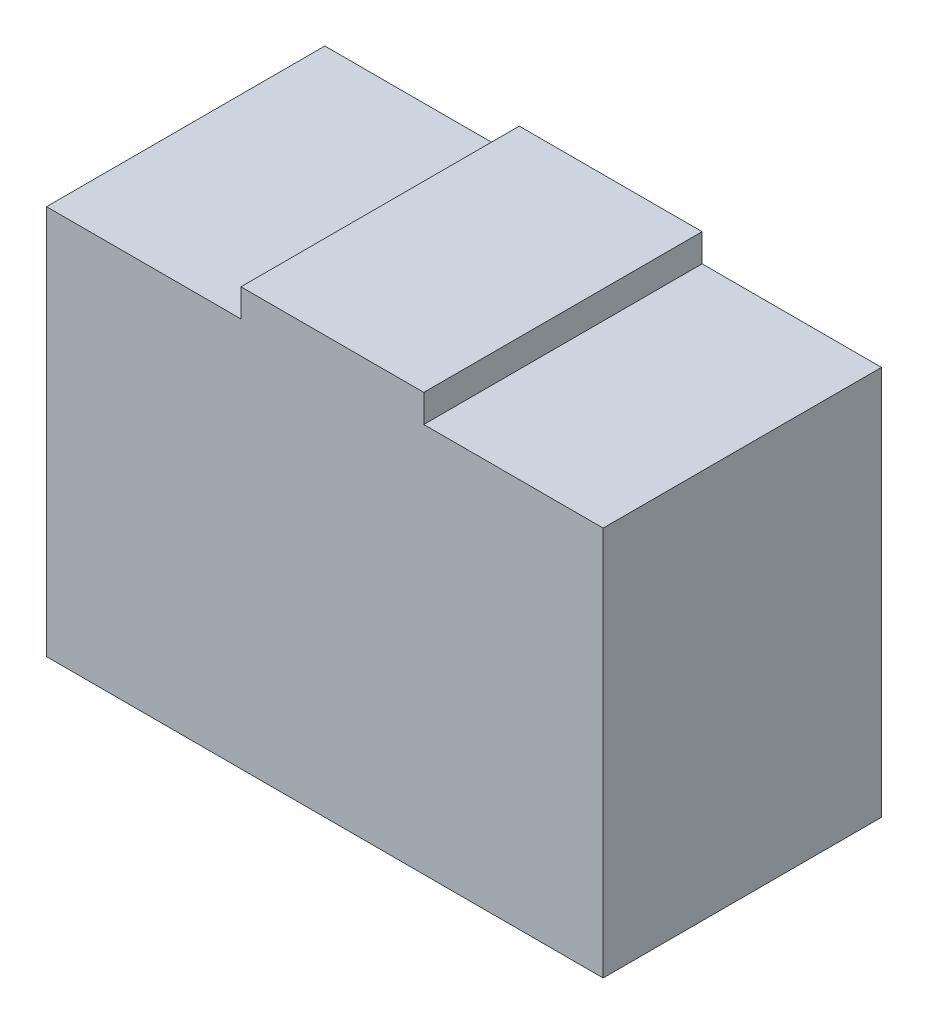
ISO-10303-21;
HEADER;
FILE_DESCRIPTION(('STEP AP214'),'2;1');
FILE_NAME('part.step','',(''),(''),'','','');
FILE_SCHEMA(('AUTOMOTIVE_DESIGN { 1 0 10303 214 1 1 1 1 }'));
ENDSEC;
DATA;
#1=APPLICATION_CONTEXT('core data for automotive mechanical design processes');
#2=APPLICATION_PROTOCOL_DEFINITION('international standard','automotive_design',2000,#1);
#3=PRODUCT_CONTEXT('',#1,'mechanical');
#4=PRODUCT('Part','Part','',(#3));
#5=PRODUCT_RELATED_PRODUCT_CATEGORY('part','',(#4));
#6=PRODUCT_DEFINITION_FORMATION('','',#4);
#7=PRODUCT_DEFINITION_CONTEXT('part definition',#1,'design');
#8=PRODUCT_DEFINITION('design','',#6,#7);
#9=PRODUCT_DEFINITION_SHAPE('','',#8);
#10=(LENGTH_UNIT() NAMED_UNIT(*) SI_UNIT(.MILLI.,.METRE.));
#11=(NAMED_UNIT(*) PLANE_ANGLE_UNIT() SI_UNIT($,.RADIAN.));
#12=(NAMED_UNIT(*) SI_UNIT($,.STERADIAN.) SOLID_ANGLE_UNIT());
#13=UNCERTAINTY_MEASURE_WITH_UNIT(LENGTH_MEASURE(1.E-05),#10,'distance_accuracy_value','');
#14=(GEOMETRIC_REPRESENTATION_CONTEXT(3) GLOBAL_UNCERTAINTY_ASSIGNED_CONTEXT((#13)) GLOBAL_UNIT_ASSIGNED_CONTEXT((#10,
#11,#12)) REPRESENTATION_CONTEXT('',''));
#15=CARTESIAN_POINT('',(0.,0.,0.));
#16=DIRECTION('',(0.,0.,1.));
#17=DIRECTION('',(1.,0.,0.));
#18=AXIS2_PLACEMENT_3D('',#15,#16,#17);
#19=CARTESIAN_POINT('',(-0.964285714285714,1.00446428571429,0.5));
#20=DIRECTION('',(0.,-1.,0.));
#21=DIRECTION('',(0.,0.,-1.));
#22=AXIS2_PLACEMENT_3D('',#19,#20,#21);
#23=PLANE('',#22);
#24=DIRECTION('',(0.,0.,1.));
#25=VECTOR('',#24,1.);
#26=CARTESIAN_POINT('',(-0.615018224617643,1.00446428571429,0.));
#27=LINE('',#26,#25);
#28=CARTESIAN_POINT('',(-0.615018224617643,1.00446428571429,0.));
#29=VERTEX_POINT('',#28);
#30=CARTESIAN_POINT('',(-0.615018224617643,1.00446428571429,0.5));
#31=VERTEX_POINT('',#30);
#32=EDGE_CURVE('E124',#29,#31,#27,.T.);
#33=ORIENTED_EDGE('',*,*,#32,.F.);
#34=DIRECTION('',(-1.,0.,0.));
#35=VECTOR('',#34,1.);
#36=CARTESIAN_POINT('',(-0.964285714285714,1.00446428571429,0.));
#37=LINE('',#36,#35);
#38=CARTESIAN_POINT('',(-0.964285714285714,1.00446428571429,0.));
#39=VERTEX_POINT('',#38);
#40=EDGE_CURVE('E147',#29,#39,#37,.T.);
#41=ORIENTED_EDGE('',*,*,#40,.T.);
#42=DIRECTION('',(0.,0.,-1.));
#43=VECTOR('',#42,1.);
#44=CARTESIAN_POINT('',(-0.964285714285714,1.00446428571429,0.5));
#45=LINE('',#44,#43);
#46=CARTESIAN_POINT('',(-0.964285714285714,1.00446428571429,0.5));
#47=VERTEX_POINT('',#46);
#48=EDGE_CURVE('E142',#47,#39,#45,.T.);
#49=ORIENTED_EDGE('',*,*,#48,.F.);
#50=DIRECTION('',(-1.,0.,0.));
#51=VECTOR('',#50,1.);
#52=CARTESIAN_POINT('',(-0.964285714285714,1.00446428571429,0.5));
#53=LINE('',#52,#51);
#54=EDGE_CURVE('E51',#31,#47,#53,.T.);
#55=ORIENTED_EDGE('',*,*,#54,.F.);
#56=EDGE_LOOP('',(#33,#41,#49,#55));
#57=FACE_BOUND('',#56,.T.);
#58=ADVANCED_FACE('F36',(#57),#23,.F.);
#59=DIRECTION('',(0.,0.,-1.));
#60=VECTOR('',#59,1.);
#61=CARTESIAN_POINT('',(-0.28653362991804,1.00446428571429,0.));
#62=LINE('',#61,#60);
#63=CARTESIAN_POINT('',(-0.28653362991804,1.00446428571429,0.5));
#64=VERTEX_POINT('',#63);
#65=CARTESIAN_POINT('',(-0.28653362991804,1.00446428571429,0.));
#66=VERTEX_POINT('',#65);
#67=EDGE_CURVE('E59',#64,#66,#62,.T.);
#68=ORIENTED_EDGE('',*,*,#67,.F.);
#69=CARTESIAN_POINT('',(0.0357142857142861,1.00446428571429,0.5));
#70=VERTEX_POINT('',#69);
#71=EDGE_CURVE('E141',#70,#64,#53,.T.);
#72=ORIENTED_EDGE('',*,*,#71,.F.);
#73=DIRECTION('',(0.,0.,-1.));
#74=VECTOR('',#73,1.);
#75=CARTESIAN_POINT('',(0.0357142857142861,1.00446428571429,0.5));
#76=LINE('',#75,#74);
#77=CARTESIAN_POINT('',(0.0357142857142861,1.00446428571429,0.));
#78=VERTEX_POINT('',#77);
#79=EDGE_CURVE('E151',#70,#78,#76,.T.);
#80=ORIENTED_EDGE('',*,*,#79,.T.);
#81=EDGE_CURVE('E137',#78,#66,#37,.T.);
#82=ORIENTED_EDGE('',*,*,#81,.T.);
#83=EDGE_LOOP('',(#68,#72,#80,#82));
#84=FACE_BOUND('',#83,.T.);
#85=ADVANCED_FACE('F167',(#84),#23,.F.);
#86=CARTESIAN_POINT('',(-0.964285714285714,1.00446428571429,0.5));
#87=DIRECTION('',(1.,0.,0.));
#88=DIRECTION('',(0.,1.,0.));
#89=AXIS2_PLACEMENT_3D('',#86,#87,#88);
#90=PLANE('',#89);
#91=DIRECTION('',(0.,-1.,0.));
#92=VECTOR('',#91,1.);
#93=CARTESIAN_POINT('',(-0.964285714285714,1.00446428571429,0.));
#94=LINE('',#93,#92);
#95=CARTESIAN_POINT('',(-0.964285714285714,0.304464285714285,0.));
#96=VERTEX_POINT('',#95);
#97=EDGE_CURVE('E125',#39,#96,#94,.T.);
#98=ORIENTED_EDGE('',*,*,#97,.T.);
#99=DIRECTION('',(0.,0.,-1.));
#100=VECTOR('',#99,1.);
#101=CARTESIAN_POINT('',(-0.964285714285714,0.304464285714285,0.5));
#102=LINE('',#101,#100);
#103=CARTESIAN_POINT('',(-0.964285714285714,0.304464285714285,0.5));
#104=VERTEX_POINT('',#103);
#105=EDGE_CURVE('E11',#104,#96,#102,.T.);
#106=ORIENTED_EDGE('',*,*,#105,.F.);
#107=DIRECTION('',(0.,-1.,0.));
#108=VECTOR('',#107,1.);
#109=CARTESIAN_POINT('',(-0.964285714285714,1.00446428571429,0.5));
#110=LINE('',#109,#108);
#111=EDGE_CURVE('E134',#47,#104,#110,.T.);
#112=ORIENTED_EDGE('',*,*,#111,.F.);
#113=ORIENTED_EDGE('',*,*,#48,.T.);
#114=EDGE_LOOP('',(#98,#106,#112,#113));
#115=FACE_BOUND('',#114,.T.);
#116=ADVANCED_FACE('F38',(#115),#90,.F.);
#117=CARTESIAN_POINT('',(-0.964285714285714,0.304464285714285,0.5));
#118=DIRECTION('',(0.,1.,0.));
#119=DIRECTION('',(0.,0.,1.));
#120=AXIS2_PLACEMENT_3D('',#117,#118,#119);
#121=PLANE('',#120);
#122=DIRECTION('',(1.,0.,0.));
#123=VECTOR('',#122,1.);
#124=CARTESIAN_POINT('',(-0.964285714285714,0.304464285714285,0.));
#125=LINE('',#124,#123);
#126=CARTESIAN_POINT('',(0.0357142857142859,0.304464285714285,0.));
#127=VERTEX_POINT('',#126);
#128=EDGE_CURVE('E128',#96,#127,#125,.T.);
#129=ORIENTED_EDGE('',*,*,#128,.T.);
#130=DIRECTION('',(0.,0.,-1.));
#131=VECTOR('',#130,1.);
#132=CARTESIAN_POINT('',(0.0357142857142859,0.304464285714285,0.5));
#133=LINE('',#132,#131);
#134=CARTESIAN_POINT('',(0.0357142857142859,0.304464285714285,0.5));
#135=VERTEX_POINT('',#134);
#136=EDGE_CURVE('E44',#135,#127,#133,.T.);
#137=ORIENTED_EDGE('',*,*,#136,.F.);
#138=DIRECTION('',(1.,0.,0.));
#139=VECTOR('',#138,1.);
#140=CARTESIAN_POINT('',(-0.964285714285714,0.304464285714285,0.5));
#141=LINE('',#140,#139);
#142=EDGE_CURVE('E136',#104,#135,#141,.T.);
#143=ORIENTED_EDGE('',*,*,#142,.F.);
#144=ORIENTED_EDGE('',*,*,#105,.T.);
#145=EDGE_LOOP('',(#129,#137,#143,#144));
#146=FACE_BOUND('',#145,.T.);
#147=ADVANCED_FACE('F180',(#146),#121,.F.);
#148=CARTESIAN_POINT('',(0.0357142857142861,1.00446428571429,0.5));
#149=DIRECTION('',(-1.,0.,0.));
#150=DIRECTION('',(0.,-1.,0.));
#151=AXIS2_PLACEMENT_3D('',#148,#149,#150);
#152=PLANE('',#151);
#153=DIRECTION('',(0.,1.,0.));
#154=VECTOR('',#153,1.);
#155=CARTESIAN_POINT('',(0.0357142857142861,1.00446428571429,0.));
#156=LINE('',#155,#154);
#157=EDGE_CURVE('E145',#127,#78,#156,.T.);
#158=ORIENTED_EDGE('',*,*,#157,.T.);
#159=ORIENTED_EDGE('',*,*,#79,.F.);
#160=DIRECTION('',(0.,1.,0.));
#161=VECTOR('',#160,1.);
#162=CARTESIAN_POINT('',(0.0357142857142861,1.00446428571429,0.5));
#163=LINE('',#162,#161);
#164=EDGE_CURVE('E139',#135,#70,#163,.T.);
#165=ORIENTED_EDGE('',*,*,#164,.F.);
#166=ORIENTED_EDGE('',*,*,#136,.T.);
#167=EDGE_LOOP('',(#158,#159,#165,#166));
#168=FACE_BOUND('',#167,.T.);
#169=ADVANCED_FACE('F158',(#168),#152,.F.);
#170=CARTESIAN_POINT('',(0.,0.,0.5));
#171=DIRECTION('',(0.,0.,1.));
#172=DIRECTION('',(1.,0.,0.));
#173=AXIS2_PLACEMENT_3D('',#170,#171,#172);
#174=PLANE('',#173);
#175=ORIENTED_EDGE('',*,*,#111,.T.);
#176=ORIENTED_EDGE('',*,*,#142,.T.);
#177=ORIENTED_EDGE('',*,*,#164,.T.);
#178=ORIENTED_EDGE('',*,*,#71,.T.);
#179=DIRECTION('',(0.,-1.,0.));
#180=VECTOR('',#179,1.);
#181=CARTESIAN_POINT('',(-0.28653362991804,1.05446428571429,0.5));
#182=LINE('',#181,#180);
#183=CARTESIAN_POINT('',(-0.28653362991804,1.05446428571429,0.5));
#184=VERTEX_POINT('',#183);
#185=EDGE_CURVE('E109',#184,#64,#182,.T.);
#186=ORIENTED_EDGE('',*,*,#185,.F.);
#187=DIRECTION('',(1.,0.,0.));
#188=VECTOR('',#187,1.);
#189=CARTESIAN_POINT('',(-0.615018224617643,1.05446428571429,0.5));
#190=LINE('',#189,#188);
#191=CARTESIAN_POINT('',(-0.615018224617643,1.05446428571429,0.5));
#192=VERTEX_POINT('',#191);
#193=EDGE_CURVE('E101',#192,#184,#190,.T.);
#194=ORIENTED_EDGE('',*,*,#193,.F.);
#195=DIRECTION('',(0.,-1.,0.));
#196=VECTOR('',#195,1.);
#197=CARTESIAN_POINT('',(-0.615018224617643,1.05446428571429,0.5));
#198=LINE('',#197,#196);
#199=EDGE_CURVE('E106',#192,#31,#198,.T.);
#200=ORIENTED_EDGE('',*,*,#199,.T.);
#201=ORIENTED_EDGE('',*,*,#54,.T.);
#202=EDGE_LOOP('',(#175,#176,#177,#178,#186,#194,#200,#201));
#203=FACE_BOUND('',#202,.T.);
#204=ADVANCED_FACE('F104',(#203),#174,.T.);
#205=CARTESIAN_POINT('',(0.,0.,0.));
#206=DIRECTION('',(0.,0.,1.));
#207=DIRECTION('',(1.,0.,0.));
#208=AXIS2_PLACEMENT_3D('',#205,#206,#207);
#209=PLANE('',#208);
#210=ORIENTED_EDGE('',*,*,#97,.F.);
#211=ORIENTED_EDGE('',*,*,#40,.F.);
#212=DIRECTION('',(0.,-1.,0.));
#213=VECTOR('',#212,1.);
#214=CARTESIAN_POINT('',(-0.615018224617643,1.05446428571429,0.));
#215=LINE('',#214,#213);
#216=CARTESIAN_POINT('',(-0.615018224617643,1.05446428571429,0.));
#217=VERTEX_POINT('',#216);
#218=EDGE_CURVE('E174',#217,#29,#215,.T.);
#219=ORIENTED_EDGE('',*,*,#218,.F.);
#220=DIRECTION('',(-1.,0.,0.));
#221=VECTOR('',#220,1.);
#222=CARTESIAN_POINT('',(-0.615018224617643,1.05446428571429,0.));
#223=LINE('',#222,#221);
#224=CARTESIAN_POINT('',(-0.28653362991804,1.05446428571429,0.));
#225=VERTEX_POINT('',#224);
#226=EDGE_CURVE('E118',#225,#217,#223,.T.);
#227=ORIENTED_EDGE('',*,*,#226,.F.);
#228=DIRECTION('',(0.,-1.,0.));
#229=VECTOR('',#228,1.);
#230=CARTESIAN_POINT('',(-0.28653362991804,1.05446428571429,0.));
#231=LINE('',#230,#229);
#232=EDGE_CURVE('E130',#225,#66,#231,.T.);
#233=ORIENTED_EDGE('',*,*,#232,.T.);
#234=ORIENTED_EDGE('',*,*,#81,.F.);
#235=ORIENTED_EDGE('',*,*,#157,.F.);
#236=ORIENTED_EDGE('',*,*,#128,.F.);
#237=EDGE_LOOP('',(#210,#211,#219,#227,#233,#234,#235,#236));
#238=FACE_BOUND('',#237,.T.);
#239=ADVANCED_FACE('F164',(#238),#209,.F.);
#240=CARTESIAN_POINT('',(-0.615018224617643,1.05446428571429,0.));
#241=DIRECTION('',(1.,0.,0.));
#242=DIRECTION('',(0.,0.,-1.));
#243=AXIS2_PLACEMENT_3D('',#240,#241,#242);
#244=PLANE('',#243);
#245=ORIENTED_EDGE('',*,*,#32,.T.);
#246=ORIENTED_EDGE('',*,*,#199,.F.);
#247=DIRECTION('',(0.,0.,1.));
#248=VECTOR('',#247,1.);
#249=CARTESIAN_POINT('',(-0.615018224617643,1.05446428571429,0.));
#250=LINE('',#249,#248);
#251=EDGE_CURVE('E113',#217,#192,#250,.T.);
#252=ORIENTED_EDGE('',*,*,#251,.F.);
#253=ORIENTED_EDGE('',*,*,#218,.T.);
#254=EDGE_LOOP('',(#245,#246,#252,#253));
#255=FACE_BOUND('',#254,.T.);
#256=ADVANCED_FACE('F123',(#255),#244,.F.);
#257=CARTESIAN_POINT('',(-0.28653362991804,1.05446428571429,0.));
#258=DIRECTION('',(-1.,0.,0.));
#259=DIRECTION('',(0.,0.,1.));
#260=AXIS2_PLACEMENT_3D('',#257,#258,#259);
#261=PLANE('',#260);
#262=ORIENTED_EDGE('',*,*,#67,.T.);
#263=ORIENTED_EDGE('',*,*,#232,.F.);
#264=DIRECTION('',(0.,0.,-1.));
#265=VECTOR('',#264,1.);
#266=CARTESIAN_POINT('',(-0.28653362991804,1.05446428571429,0.));
#267=LINE('',#266,#265);
#268=EDGE_CURVE('E112',#184,#225,#267,.T.);
#269=ORIENTED_EDGE('',*,*,#268,.F.);
#270=ORIENTED_EDGE('',*,*,#185,.T.);
#271=EDGE_LOOP('',(#262,#263,#269,#270));
#272=FACE_BOUND('',#271,.T.);
#273=ADVANCED_FACE('F169',(#272),#261,.F.);
#274=CARTESIAN_POINT('',(0.,1.05446428571429,0.));
#275=DIRECTION('',(0.,1.,0.));
#276=DIRECTION('',(0.,0.,1.));
#277=AXIS2_PLACEMENT_3D('',#274,#275,#276);
#278=PLANE('',#277);
#279=ORIENTED_EDGE('',*,*,#251,.T.);
#280=ORIENTED_EDGE('',*,*,#193,.T.);
#281=ORIENTED_EDGE('',*,*,#268,.T.);
#282=ORIENTED_EDGE('',*,*,#226,.T.);
#283=EDGE_LOOP('',(#279,#280,#281,#282));
#284=FACE_BOUND('',#283,.T.);
#285=ADVANCED_FACE('F116',(#284),#278,.T.);
#286=CLOSED_SHELL('',(#58,#85,#116,#147,#169,#204,#239,#256,#273,#285));
#287=MANIFOLD_SOLID_BREP('B2',#286);
#288=ADVANCED_BREP_SHAPE_REPRESENTATION('',(#18,#287),#14);
#289=SHAPE_DEFINITION_REPRESENTATION(#9,#288);
ENDSEC;
END-ISO-10303-21;
